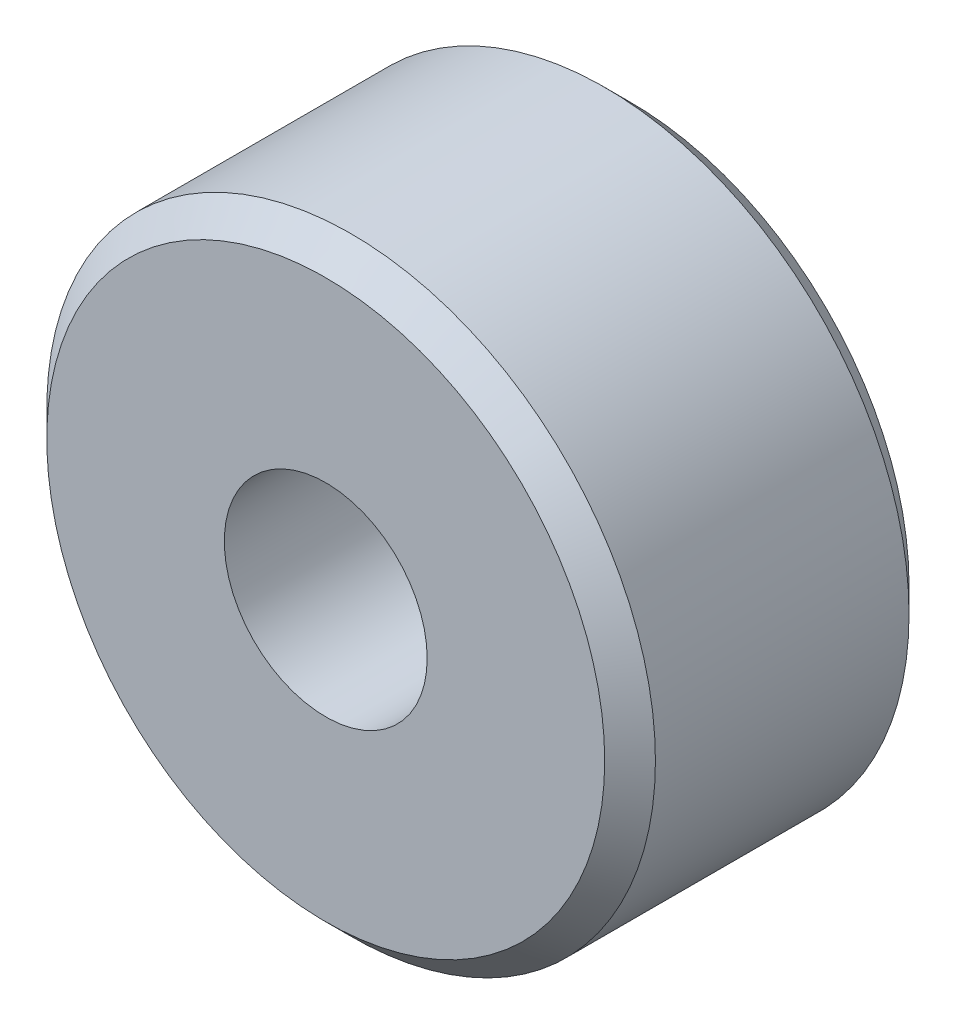
ISO-10303-21;
HEADER;
FILE_DESCRIPTION(('STEP AP214'),'2;1');
FILE_NAME('part.step','',(''),(''),'','','');
FILE_SCHEMA(('AUTOMOTIVE_DESIGN { 1 0 10303 214 1 1 1 1 }'));
ENDSEC;
DATA;
#1=APPLICATION_CONTEXT('core data for automotive mechanical design processes');
#2=APPLICATION_PROTOCOL_DEFINITION('international standard','automotive_design',2000,#1);
#3=PRODUCT_CONTEXT('',#1,'mechanical');
#4=PRODUCT('Part','Part','',(#3));
#5=PRODUCT_RELATED_PRODUCT_CATEGORY('part','',(#4));
#6=PRODUCT_DEFINITION_FORMATION('','',#4);
#7=PRODUCT_DEFINITION_CONTEXT('part definition',#1,'design');
#8=PRODUCT_DEFINITION('design','',#6,#7);
#9=PRODUCT_DEFINITION_SHAPE('','',#8);
#10=(LENGTH_UNIT() NAMED_UNIT(*) SI_UNIT(.MILLI.,.METRE.));
#11=(NAMED_UNIT(*) PLANE_ANGLE_UNIT() SI_UNIT($,.RADIAN.));
#12=(NAMED_UNIT(*) SI_UNIT($,.STERADIAN.) SOLID_ANGLE_UNIT());
#13=UNCERTAINTY_MEASURE_WITH_UNIT(LENGTH_MEASURE(1.E-05),#10,'distance_accuracy_value','');
#14=(GEOMETRIC_REPRESENTATION_CONTEXT(3) GLOBAL_UNCERTAINTY_ASSIGNED_CONTEXT((#13)) GLOBAL_UNIT_ASSIGNED_CONTEXT((#10,
#11,#12)) REPRESENTATION_CONTEXT('',''));
#15=CARTESIAN_POINT('',(0.,0.,0.));
#16=DIRECTION('',(0.,0.,1.));
#17=DIRECTION('',(1.,0.,0.));
#18=AXIS2_PLACEMENT_3D('',#15,#16,#17);
#19=CARTESIAN_POINT('',(0.,0.,3.));
#20=DIRECTION('',(0.,0.,1.));
#21=DIRECTION('',(1.,0.,0.));
#22=AXIS2_PLACEMENT_3D('',#19,#20,#21);
#23=PLANE('',#22);
#24=CARTESIAN_POINT('',(0.,0.,3.));
#25=DIRECTION('',(0.,0.,1.));
#26=DIRECTION('',(1.,0.,0.));
#27=AXIS2_PLACEMENT_3D('',#24,#25,#26);
#28=CIRCLE('',#27,2.75);
#29=CARTESIAN_POINT('',(2.75,0.,3.));
#30=VERTEX_POINT('',#29);
#31=EDGE_CURVE('E11',#30,#30,#28,.T.);
#32=ORIENTED_EDGE('',*,*,#31,.T.);
#33=EDGE_LOOP('',(#32));
#34=FACE_BOUND('',#33,.T.);
#35=CARTESIAN_POINT('',(0.,0.,3.));
#36=DIRECTION('',(0.,0.,1.));
#37=DIRECTION('',(1.,0.,0.));
#38=AXIS2_PLACEMENT_3D('',#35,#36,#37);
#39=CIRCLE('',#38,1.);
#40=CARTESIAN_POINT('',(1.,0.,3.));
#41=VERTEX_POINT('',#40);
#42=EDGE_CURVE('E56',#41,#41,#39,.T.);
#43=ORIENTED_EDGE('',*,*,#42,.F.);
#44=EDGE_LOOP('',(#43));
#45=FACE_BOUND('',#44,.T.);
#46=ADVANCED_FACE('F36',(#34,#45),#23,.T.);
#47=CARTESIAN_POINT('',(0.,0.,0.));
#48=DIRECTION('',(0.,0.,1.));
#49=DIRECTION('',(1.,0.,0.));
#50=AXIS2_PLACEMENT_3D('',#47,#48,#49);
#51=PLANE('',#50);
#52=CARTESIAN_POINT('',(0.,0.,0.));
#53=DIRECTION('',(0.,0.,1.));
#54=DIRECTION('',(1.,0.,0.));
#55=AXIS2_PLACEMENT_3D('',#52,#53,#54);
#56=CIRCLE('',#55,2.75);
#57=CARTESIAN_POINT('',(2.75,0.,0.));
#58=VERTEX_POINT('',#57);
#59=EDGE_CURVE('E43',#58,#58,#56,.F.);
#60=ORIENTED_EDGE('',*,*,#59,.T.);
#61=EDGE_LOOP('',(#60));
#62=FACE_BOUND('',#61,.T.);
#63=CARTESIAN_POINT('',(0.,0.,0.));
#64=DIRECTION('',(0.,0.,1.));
#65=DIRECTION('',(1.,0.,0.));
#66=AXIS2_PLACEMENT_3D('',#63,#64,#65);
#67=CIRCLE('',#66,1.);
#68=CARTESIAN_POINT('',(1.,0.,0.));
#69=VERTEX_POINT('',#68);
#70=EDGE_CURVE('E57',#69,#69,#67,.T.);
#71=ORIENTED_EDGE('',*,*,#70,.T.);
#72=EDGE_LOOP('',(#71));
#73=FACE_BOUND('',#72,.T.);
#74=ADVANCED_FACE('F67',(#62,#73),#51,.F.);
#75=CARTESIAN_POINT('',(0.,0.,3.));
#76=DIRECTION('',(0.,0.,-1.));
#77=DIRECTION('',(-1.,0.,0.));
#78=AXIS2_PLACEMENT_3D('',#75,#76,#77);
#79=CYLINDRICAL_SURFACE('',#78,3.);
#80=CARTESIAN_POINT('',(0.,0.,0.250000000000001));
#81=DIRECTION('',(0.,0.,1.));
#82=DIRECTION('',(1.,0.,0.));
#83=AXIS2_PLACEMENT_3D('',#80,#81,#82);
#84=CIRCLE('',#83,3.);
#85=CARTESIAN_POINT('',(3.,0.,0.250000000000001));
#86=VERTEX_POINT('',#85);
#87=EDGE_CURVE('E47',#86,#86,#84,.T.);
#88=ORIENTED_EDGE('',*,*,#87,.T.);
#89=EDGE_LOOP('',(#88));
#90=FACE_BOUND('',#89,.T.);
#91=CARTESIAN_POINT('',(0.,0.,2.75));
#92=DIRECTION('',(0.,0.,1.));
#93=DIRECTION('',(1.,0.,0.));
#94=AXIS2_PLACEMENT_3D('',#91,#92,#93);
#95=CIRCLE('',#94,3.);
#96=CARTESIAN_POINT('',(3.,0.,2.75));
#97=VERTEX_POINT('',#96);
#98=EDGE_CURVE('E51',#97,#97,#95,.F.);
#99=ORIENTED_EDGE('',*,*,#98,.T.);
#100=EDGE_LOOP('',(#99));
#101=FACE_BOUND('',#100,.T.);
#102=ADVANCED_FACE('F72',(#90,#101),#79,.T.);
#103=CARTESIAN_POINT('',(0.,0.,3.));
#104=DIRECTION('',(0.,0.,-1.));
#105=DIRECTION('',(-1.,0.,0.));
#106=AXIS2_PLACEMENT_3D('',#103,#104,#105);
#107=CYLINDRICAL_SURFACE('',#106,1.);
#108=ORIENTED_EDGE('',*,*,#42,.T.);
#109=EDGE_LOOP('',(#108));
#110=FACE_BOUND('',#109,.T.);
#111=ORIENTED_EDGE('',*,*,#70,.F.);
#112=EDGE_LOOP('',(#111));
#113=FACE_BOUND('',#112,.T.);
#114=ADVANCED_FACE('F63',(#110,#113),#107,.F.);
#115=CARTESIAN_POINT('',(0.,0.,0.250000000000001));
#116=DIRECTION('',(0.,0.,1.));
#117=DIRECTION('',(1.,0.,0.));
#118=AXIS2_PLACEMENT_3D('',#115,#116,#117);
#119=CONICAL_SURFACE('',#118,3.,0.78539816339745);
#120=ORIENTED_EDGE('',*,*,#59,.F.);
#121=EDGE_LOOP('',(#120));
#122=FACE_BOUND('',#121,.T.);
#123=ORIENTED_EDGE('',*,*,#87,.F.);
#124=EDGE_LOOP('',(#123));
#125=FACE_BOUND('',#124,.T.);
#126=ADVANCED_FACE('F78',(#122,#125),#119,.T.);
#127=CARTESIAN_POINT('',(0.,0.,3.));
#128=DIRECTION('',(0.,0.,-1.));
#129=DIRECTION('',(-1.,0.,0.));
#130=AXIS2_PLACEMENT_3D('',#127,#128,#129);
#131=CONICAL_SURFACE('',#130,2.75,0.785398163397447);
#132=ORIENTED_EDGE('',*,*,#98,.F.);
#133=EDGE_LOOP('',(#132));
#134=FACE_BOUND('',#133,.T.);
#135=ORIENTED_EDGE('',*,*,#31,.F.);
#136=EDGE_LOOP('',(#135));
#137=FACE_BOUND('',#136,.T.);
#138=ADVANCED_FACE('F38',(#134,#137),#131,.T.);
#139=CLOSED_SHELL('',(#46,#74,#102,#114,#126,#138));
#140=MANIFOLD_SOLID_BREP('B2',#139);
#141=ADVANCED_BREP_SHAPE_REPRESENTATION('',(#18,#140),#14);
#142=SHAPE_DEFINITION_REPRESENTATION(#9,#141);
ENDSEC;
END-ISO-10303-21;
